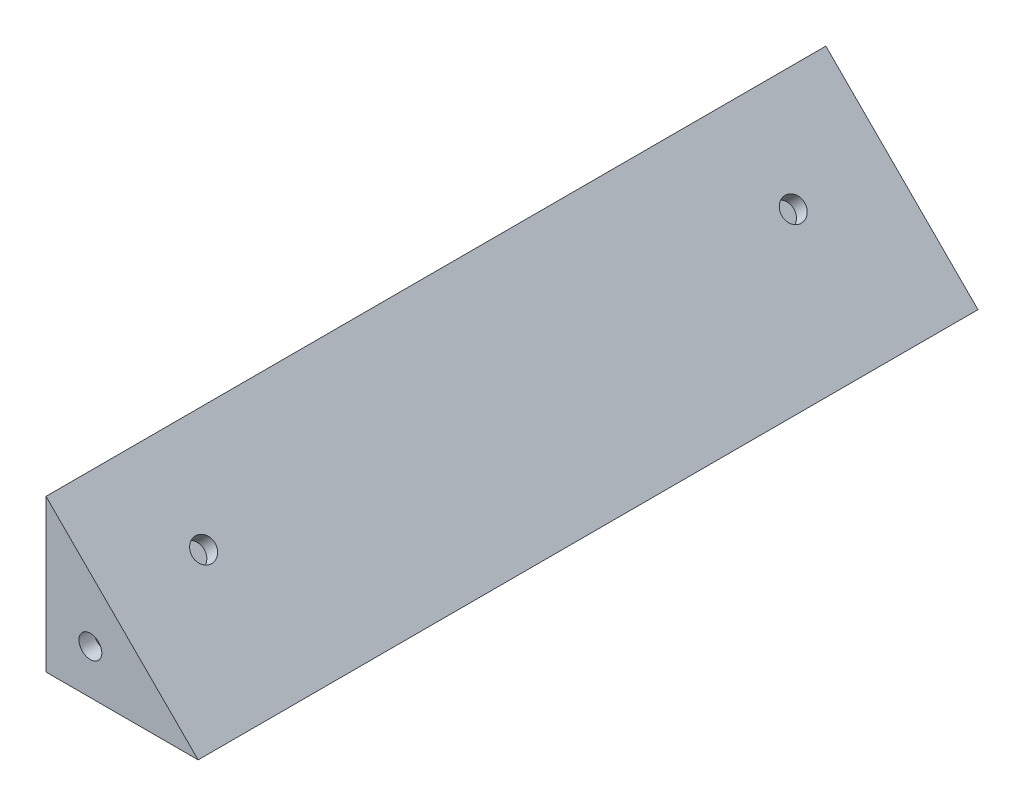
ISO-10303-21;
HEADER;
FILE_DESCRIPTION(('STEP AP214'),'2;1');
FILE_NAME('part.step','',(''),(''),'','','');
FILE_SCHEMA(('AUTOMOTIVE_DESIGN { 1 0 10303 214 1 1 1 1 }'));
ENDSEC;
DATA;
#1=APPLICATION_CONTEXT('core data for automotive mechanical design processes');
#2=APPLICATION_PROTOCOL_DEFINITION('international standard','automotive_design',2000,#1);
#3=PRODUCT_CONTEXT('',#1,'mechanical');
#4=PRODUCT('Part','Part','',(#3));
#5=PRODUCT_RELATED_PRODUCT_CATEGORY('part','',(#4));
#6=PRODUCT_DEFINITION_FORMATION('','',#4);
#7=PRODUCT_DEFINITION_CONTEXT('part definition',#1,'design');
#8=PRODUCT_DEFINITION('design','',#6,#7);
#9=PRODUCT_DEFINITION_SHAPE('','',#8);
#10=(LENGTH_UNIT() NAMED_UNIT(*) SI_UNIT(.MILLI.,.METRE.));
#11=(NAMED_UNIT(*) PLANE_ANGLE_UNIT() SI_UNIT($,.RADIAN.));
#12=(NAMED_UNIT(*) SI_UNIT($,.STERADIAN.) SOLID_ANGLE_UNIT());
#13=UNCERTAINTY_MEASURE_WITH_UNIT(LENGTH_MEASURE(1.E-05),#10,'distance_accuracy_value','');
#14=(GEOMETRIC_REPRESENTATION_CONTEXT(3) GLOBAL_UNCERTAINTY_ASSIGNED_CONTEXT((#13)) GLOBAL_UNIT_ASSIGNED_CONTEXT((#10,
#11,#12)) REPRESENTATION_CONTEXT('',''));
#15=CARTESIAN_POINT('',(0.,0.,0.));
#16=DIRECTION('',(0.,0.,1.));
#17=DIRECTION('',(1.,0.,0.));
#18=AXIS2_PLACEMENT_3D('',#15,#16,#17);
#19=CARTESIAN_POINT('',(3.73725830020305,3.73725830020305,5.));
#20=DIRECTION('',(0.,0.,-1.));
#21=DIRECTION('',(0.,1.,0.));
#22=AXIS2_PLACEMENT_3D('',#19,#20,#21);
#23=PLANE('',#22);
#24=DIRECTION('',(-0.707106781186547,0.707106781186548,0.));
#25=VECTOR('',#24,1.);
#26=CARTESIAN_POINT('',(5.15147186257615,5.15147186257615,5.));
#27=LINE('',#26,#25);
#28=CARTESIAN_POINT('',(10.3029437251523,0.,5.));
#29=VERTEX_POINT('',#28);
#30=CARTESIAN_POINT('',(3.05978332455101,7.24316040060128,5.));
#31=VERTEX_POINT('',#30);
#32=EDGE_CURVE('E243',#29,#31,#27,.T.);
#33=ORIENTED_EDGE('',*,*,#32,.T.);
#34=DIRECTION('',(0.707106781186548,0.707106781186548,0.));
#35=VECTOR('',#34,1.);
#36=CARTESIAN_POINT('',(1.64556976217791,5.82894683822819,5.));
#37=LINE('',#36,#35);
#38=CARTESIAN_POINT('',(1.64556976217791,5.82894683822819,5.));
#39=VERTEX_POINT('',#38);
#40=EDGE_CURVE('E312',#39,#31,#37,.T.);
#41=ORIENTED_EDGE('',*,*,#40,.F.);
#42=DIRECTION('',(-0.707106781186547,0.707106781186548,0.));
#43=VECTOR('',#42,1.);
#44=CARTESIAN_POINT('',(3.73725830020305,3.73725830020305,5.));
#45=LINE('',#44,#43);
#46=CARTESIAN_POINT('',(7.4745166004061,0.,5.));
#47=VERTEX_POINT('',#46);
#48=EDGE_CURVE('E245',#47,#39,#45,.T.);
#49=ORIENTED_EDGE('',*,*,#48,.F.);
#50=DIRECTION('',(-1.,0.,0.));
#51=VECTOR('',#50,1.);
#52=CARTESIAN_POINT('',(0.,0.,5.));
#53=LINE('',#52,#51);
#54=EDGE_CURVE('E237',#29,#47,#53,.T.);
#55=ORIENTED_EDGE('',*,*,#54,.F.);
#56=EDGE_LOOP('',(#33,#41,#49,#55));
#57=FACE_BOUND('',#56,.T.);
#58=ADVANCED_FACE('F79',(#57),#23,.F.);
#59=CARTESIAN_POINT('',(3.73725830020305,3.73725830020305,10.));
#60=DIRECTION('',(0.,0.,1.));
#61=DIRECTION('',(1.,0.,0.));
#62=AXIS2_PLACEMENT_3D('',#59,#60,#61);
#63=PLANE('',#62);
#64=DIRECTION('',(0.707106781186547,-0.707106781186548,0.));
#65=VECTOR('',#64,1.);
#66=CARTESIAN_POINT('',(5.15147186257615,5.15147186257615,10.));
#67=LINE('',#66,#65);
#68=CARTESIAN_POINT('',(3.05978332455101,7.24316040060128,10.));
#69=VERTEX_POINT('',#68);
#70=CARTESIAN_POINT('',(10.3029437251523,0.,10.));
#71=VERTEX_POINT('',#70);
#72=EDGE_CURVE('E261',#69,#71,#67,.T.);
#73=ORIENTED_EDGE('',*,*,#72,.T.);
#74=DIRECTION('',(1.,0.,0.));
#75=VECTOR('',#74,1.);
#76=CARTESIAN_POINT('',(0.,0.,10.));
#77=LINE('',#76,#75);
#78=CARTESIAN_POINT('',(7.4745166004061,0.,10.));
#79=VERTEX_POINT('',#78);
#80=EDGE_CURVE('E239',#79,#71,#77,.T.);
#81=ORIENTED_EDGE('',*,*,#80,.F.);
#82=DIRECTION('',(0.707106781186547,-0.707106781186548,0.));
#83=VECTOR('',#82,1.);
#84=CARTESIAN_POINT('',(3.73725830020305,3.73725830020305,10.));
#85=LINE('',#84,#83);
#86=CARTESIAN_POINT('',(1.64556976217791,5.82894683822819,10.));
#87=VERTEX_POINT('',#86);
#88=EDGE_CURVE('E309',#87,#79,#85,.T.);
#89=ORIENTED_EDGE('',*,*,#88,.F.);
#90=DIRECTION('',(0.707106781186548,0.707106781186548,0.));
#91=VECTOR('',#90,1.);
#92=CARTESIAN_POINT('',(1.64556976217791,5.82894683822819,10.));
#93=LINE('',#92,#91);
#94=EDGE_CURVE('E285',#87,#69,#93,.T.);
#95=ORIENTED_EDGE('',*,*,#94,.T.);
#96=EDGE_LOOP('',(#73,#81,#89,#95));
#97=FACE_BOUND('',#96,.T.);
#98=ADVANCED_FACE('F475',(#97),#63,.F.);
#99=CARTESIAN_POINT('',(-0.893370281794774,8.36788688220088,3.78089240474743));
#100=DIRECTION('',(-0.612372435695794,0.612372435695795,0.5));
#101=DIRECTION('',(-0.707106781186548,-0.707106781186548,0.));
#102=AXIS2_PLACEMENT_3D('',#99,#100,#101);
#103=PLANE('',#102);
#104=DIRECTION('',(0.353553390593274,-0.353553390593274,0.866025403784439));
#105=VECTOR('',#104,1.);
#106=CARTESIAN_POINT('',(0.520843280578321,9.78210044457397,3.78089240474743));
#107=LINE('',#106,#105);
#108=CARTESIAN_POINT('',(2.03916259839135,8.26378112676094,7.5));
#109=VERTEX_POINT('',#108);
#110=EDGE_CURVE('E100',#109,#69,#107,.T.);
#111=ORIENTED_EDGE('',*,*,#110,.T.);
#112=ORIENTED_EDGE('',*,*,#94,.F.);
#113=DIRECTION('',(0.353553390593274,-0.353553390593274,0.866025403784439));
#114=VECTOR('',#113,1.);
#115=CARTESIAN_POINT('',(-0.893370281794774,8.36788688220088,3.78089240474743));
#116=LINE('',#115,#114);
#117=CARTESIAN_POINT('',(0.624949036018256,6.84956756438784,7.5));
#118=VERTEX_POINT('',#117);
#119=EDGE_CURVE('E306',#118,#87,#116,.T.);
#120=ORIENTED_EDGE('',*,*,#119,.F.);
#121=DIRECTION('',(0.707106781186548,0.707106781186548,0.));
#122=VECTOR('',#121,1.);
#123=CARTESIAN_POINT('',(0.624949036018256,6.84956756438784,7.5));
#124=LINE('',#123,#122);
#125=EDGE_CURVE('E314',#118,#109,#124,.T.);
#126=ORIENTED_EDGE('',*,*,#125,.T.);
#127=EDGE_LOOP('',(#111,#112,#120,#126));
#128=FACE_BOUND('',#127,.T.);
#129=ADVANCED_FACE('F480',(#128),#103,.F.);
#130=CARTESIAN_POINT('',(3.69942298592369,3.77509361448241,-0.0308924047474255));
#131=DIRECTION('',(-0.612372435695794,0.612372435695794,-0.500000000000001));
#132=DIRECTION('',(-0.707106781186548,-0.707106781186548,0.));
#133=AXIS2_PLACEMENT_3D('',#130,#131,#132);
#134=PLANE('',#133);
#135=DIRECTION('',(-0.353553390593274,0.353553390593274,0.866025403784438));
#136=VECTOR('',#135,1.);
#137=CARTESIAN_POINT('',(5.11363654829678,5.18930717685551,-0.0308924047474255));
#138=LINE('',#137,#136);
#139=EDGE_CURVE('E251',#31,#109,#138,.T.);
#140=ORIENTED_EDGE('',*,*,#139,.T.);
#141=ORIENTED_EDGE('',*,*,#125,.F.);
#142=DIRECTION('',(-0.353553390593274,0.353553390593274,0.866025403784438));
#143=VECTOR('',#142,1.);
#144=CARTESIAN_POINT('',(3.69942298592369,3.77509361448241,-0.0308924047474255));
#145=LINE('',#144,#143);
#146=EDGE_CURVE('E303',#39,#118,#145,.T.);
#147=ORIENTED_EDGE('',*,*,#146,.F.);
#148=ORIENTED_EDGE('',*,*,#40,.T.);
#149=EDGE_LOOP('',(#140,#141,#147,#148));
#150=FACE_BOUND('',#149,.T.);
#151=ADVANCED_FACE('F485',(#150),#134,.F.);
#152=CARTESIAN_POINT('',(3.73725830020315,3.73725830020295,56.5));
#153=DIRECTION('',(0.,0.,1.));
#154=DIRECTION('',(0.,-1.,0.));
#155=AXIS2_PLACEMENT_3D('',#152,#153,#154);
#156=PLANE('',#155);
#157=DIRECTION('',(0.707106781186547,-0.707106781186548,0.));
#158=VECTOR('',#157,1.);
#159=CARTESIAN_POINT('',(5.15147186257624,5.15147186257605,56.5));
#160=LINE('',#159,#158);
#161=CARTESIAN_POINT('',(3.05978332455101,7.24316040060129,56.5));
#162=VERTEX_POINT('',#161);
#163=CARTESIAN_POINT('',(10.3029437251523,0.,56.5));
#164=VERTEX_POINT('',#163);
#165=EDGE_CURVE('E270',#162,#164,#160,.T.);
#166=ORIENTED_EDGE('',*,*,#165,.T.);
#167=DIRECTION('',(1.,0.,0.));
#168=VECTOR('',#167,1.);
#169=CARTESIAN_POINT('',(0.,0.,56.5));
#170=LINE('',#169,#168);
#171=CARTESIAN_POINT('',(7.4745166004061,0.,56.5));
#172=VERTEX_POINT('',#171);
#173=EDGE_CURVE('E319',#172,#164,#170,.T.);
#174=ORIENTED_EDGE('',*,*,#173,.F.);
#175=DIRECTION('',(0.707106781186547,-0.707106781186548,0.));
#176=VECTOR('',#175,1.);
#177=CARTESIAN_POINT('',(3.73725830020315,3.73725830020295,56.5));
#178=LINE('',#177,#176);
#179=CARTESIAN_POINT('',(1.64556976217791,5.82894683822819,56.5));
#180=VERTEX_POINT('',#179);
#181=EDGE_CURVE('E281',#180,#172,#178,.T.);
#182=ORIENTED_EDGE('',*,*,#181,.F.);
#183=DIRECTION('',(0.707106781186548,0.707106781186548,0.));
#184=VECTOR('',#183,1.);
#185=CARTESIAN_POINT('',(1.64556976217791,5.82894683822819,56.5));
#186=LINE('',#185,#184);
#187=EDGE_CURVE('E294',#180,#162,#186,.T.);
#188=ORIENTED_EDGE('',*,*,#187,.T.);
#189=EDGE_LOOP('',(#166,#174,#182,#188));
#190=FACE_BOUND('',#189,.T.);
#191=ADVANCED_FACE('F458',(#190),#156,.F.);
#192=CARTESIAN_POINT('',(3.73725830020314,3.73725830020296,51.5));
#193=DIRECTION('',(0.,0.,-1.));
#194=DIRECTION('',(0.,1.,0.));
#195=AXIS2_PLACEMENT_3D('',#192,#193,#194);
#196=PLANE('',#195);
#197=DIRECTION('',(-0.707106781186547,0.707106781186548,0.));
#198=VECTOR('',#197,1.);
#199=CARTESIAN_POINT('',(5.15147186257623,5.15147186257606,51.5));
#200=LINE('',#199,#198);
#201=CARTESIAN_POINT('',(10.3029437251523,0.,51.5));
#202=VERTEX_POINT('',#201);
#203=CARTESIAN_POINT('',(3.05978332455101,7.24316040060128,51.5));
#204=VERTEX_POINT('',#203);
#205=EDGE_CURVE('E273',#202,#204,#200,.T.);
#206=ORIENTED_EDGE('',*,*,#205,.T.);
#207=DIRECTION('',(0.707106781186548,0.707106781186548,0.));
#208=VECTOR('',#207,1.);
#209=CARTESIAN_POINT('',(1.64556976217792,5.82894683822818,51.5));
#210=LINE('',#209,#208);
#211=CARTESIAN_POINT('',(1.64556976217792,5.82894683822818,51.5));
#212=VERTEX_POINT('',#211);
#213=EDGE_CURVE('E293',#212,#204,#210,.T.);
#214=ORIENTED_EDGE('',*,*,#213,.F.);
#215=DIRECTION('',(-0.707106781186547,0.707106781186548,0.));
#216=VECTOR('',#215,1.);
#217=CARTESIAN_POINT('',(3.73725830020314,3.73725830020296,51.5));
#218=LINE('',#217,#216);
#219=CARTESIAN_POINT('',(7.4745166004061,0.,51.5));
#220=VERTEX_POINT('',#219);
#221=EDGE_CURVE('E284',#220,#212,#218,.T.);
#222=ORIENTED_EDGE('',*,*,#221,.F.);
#223=DIRECTION('',(-1.,0.,0.));
#224=VECTOR('',#223,1.);
#225=CARTESIAN_POINT('',(0.,0.,51.5));
#226=LINE('',#225,#224);
#227=EDGE_CURVE('E246',#202,#220,#226,.T.);
#228=ORIENTED_EDGE('',*,*,#227,.F.);
#229=EDGE_LOOP('',(#206,#214,#222,#228));
#230=FACE_BOUND('',#229,.T.);
#231=ADVANCED_FACE('F446',(#230),#196,.F.);
#232=CARTESIAN_POINT('',(-15.131029411722,22.6055460121282,15.4058924047476));
#233=DIRECTION('',(-0.612372435695794,0.612372435695794,0.500000000000002));
#234=DIRECTION('',(-0.707106781186548,-0.707106781186547,0.));
#235=AXIS2_PLACEMENT_3D('',#232,#233,#234);
#236=PLANE('',#235);
#237=DIRECTION('',(0.353553390593275,-0.353553390593276,0.866025403784437));
#238=VECTOR('',#237,1.);
#239=CARTESIAN_POINT('',(-13.7168158493489,24.0197595745012,15.4058924047476));
#240=LINE('',#239,#238);
#241=CARTESIAN_POINT('',(2.03916259839135,8.26378112676094,54.));
#242=VERTEX_POINT('',#241);
#243=EDGE_CURVE('E277',#242,#162,#240,.T.);
#244=ORIENTED_EDGE('',*,*,#243,.T.);
#245=ORIENTED_EDGE('',*,*,#187,.F.);
#246=DIRECTION('',(0.353553390593275,-0.353553390593276,0.866025403784437));
#247=VECTOR('',#246,1.);
#248=CARTESIAN_POINT('',(-15.131029411722,22.6055460121282,15.4058924047476));
#249=LINE('',#248,#247);
#250=CARTESIAN_POINT('',(0.624949036018251,6.84956756438785,54.));
#251=VERTEX_POINT('',#250);
#252=EDGE_CURVE('E290',#251,#180,#249,.T.);
#253=ORIENTED_EDGE('',*,*,#252,.F.);
#254=DIRECTION('',(0.707106781186548,0.707106781186548,0.));
#255=VECTOR('',#254,1.);
#256=CARTESIAN_POINT('',(0.624949036018251,6.84956756438785,54.));
#257=LINE('',#256,#255);
#258=EDGE_CURVE('E297',#251,#242,#257,.T.);
#259=ORIENTED_EDGE('',*,*,#258,.T.);
#260=EDGE_LOOP('',(#244,#245,#253,#259));
#261=FACE_BOUND('',#260,.T.);
#262=ADVANCED_FACE('F454',(#261),#236,.F.);
#263=CARTESIAN_POINT('',(17.9370821158509,-10.4625655154448,11.5941075952525));
#264=DIRECTION('',(-0.612372435695795,0.612372435695795,-0.499999999999998));
#265=DIRECTION('',(-0.707106781186548,-0.707106781186547,0.));
#266=AXIS2_PLACEMENT_3D('',#263,#264,#265);
#267=PLANE('',#266);
#268=DIRECTION('',(-0.353553390593272,0.353553390593273,0.86602540378444));
#269=VECTOR('',#268,1.);
#270=CARTESIAN_POINT('',(19.351295678224,-9.04835195307167,11.5941075952525));
#271=LINE('',#270,#269);
#272=EDGE_CURVE('E275',#204,#242,#271,.T.);
#273=ORIENTED_EDGE('',*,*,#272,.T.);
#274=ORIENTED_EDGE('',*,*,#258,.F.);
#275=DIRECTION('',(-0.353553390593272,0.353553390593273,0.86602540378444));
#276=VECTOR('',#275,1.);
#277=CARTESIAN_POINT('',(17.9370821158509,-10.4625655154448,11.5941075952525));
#278=LINE('',#277,#276);
#279=EDGE_CURVE('E287',#212,#251,#278,.T.);
#280=ORIENTED_EDGE('',*,*,#279,.F.);
#281=ORIENTED_EDGE('',*,*,#213,.T.);
#282=EDGE_LOOP('',(#273,#274,#280,#281));
#283=FACE_BOUND('',#282,.T.);
#284=ADVANCED_FACE('F451',(#283),#267,.F.);
#285=CARTESIAN_POINT('',(1.73223304703364,1.73223304703364,58.3));
#286=DIRECTION('',(-0.707106781186548,-0.707106781186548,0.));
#287=DIRECTION('',(0.707106781186548,-0.707106781186548,0.));
#288=AXIS2_PLACEMENT_3D('',#285,#286,#287);
#289=PLANE('',#288);
#290=DIRECTION('',(0.707106781186547,-0.707106781186548,0.));
#291=VECTOR('',#290,1.);
#292=CARTESIAN_POINT('',(1.73223304703364,1.73223304703364,60.3));
#293=LINE('',#292,#291);
#294=CARTESIAN_POINT('',(0.711612320873983,2.75285377319329,60.3));
#295=VERTEX_POINT('',#294);
#296=CARTESIAN_POINT('',(3.46446609406726,0.,60.3));
#297=VERTEX_POINT('',#296);
#298=EDGE_CURVE('E326',#295,#297,#293,.T.);
#299=ORIENTED_EDGE('',*,*,#298,.T.);
#300=DIRECTION('',(0.,0.,1.));
#301=VECTOR('',#300,1.);
#302=CARTESIAN_POINT('',(3.46446609406726,0.,58.3));
#303=LINE('',#302,#301);
#304=CARTESIAN_POINT('',(3.46446609406726,0.,58.3));
#305=VERTEX_POINT('',#304);
#306=EDGE_CURVE('E354',#305,#297,#303,.T.);
#307=ORIENTED_EDGE('',*,*,#306,.F.);
#308=DIRECTION('',(0.707106781186547,-0.707106781186548,0.));
#309=VECTOR('',#308,1.);
#310=CARTESIAN_POINT('',(1.73223304703364,1.73223304703364,58.3));
#311=LINE('',#310,#309);
#312=CARTESIAN_POINT('',(0.711612320873983,2.75285377319329,58.3));
#313=VERTEX_POINT('',#312);
#314=EDGE_CURVE('E337',#313,#305,#311,.T.);
#315=ORIENTED_EDGE('',*,*,#314,.F.);
#316=DIRECTION('',(0.,0.,1.));
#317=VECTOR('',#316,1.);
#318=CARTESIAN_POINT('',(0.711612320873983,2.75285377319329,58.3));
#319=LINE('',#318,#317);
#320=EDGE_CURVE('E355',#313,#295,#319,.T.);
#321=ORIENTED_EDGE('',*,*,#320,.T.);
#322=EDGE_LOOP('',(#299,#307,#315,#321));
#323=FACE_BOUND('',#322,.T.);
#324=ADVANCED_FACE('F505',(#323),#289,.F.);
#325=CARTESIAN_POINT('',(-0.0242701090998959,0.00650315613353235,58.3));
#326=DIRECTION('',(-0.965925826289068,0.258819045102521,0.));
#327=DIRECTION('',(-0.258819045102521,-0.965925826289068,0.));
#328=AXIS2_PLACEMENT_3D('',#325,#326,#327);
#329=PLANE('',#328);
#330=DIRECTION('',(-0.258819045102521,-0.965925826289068,0.));
#331=VECTOR('',#330,1.);
#332=CARTESIAN_POINT('',(-0.0242701090998959,0.00650315613353235,60.3));
#333=LINE('',#332,#331);
#334=CARTESIAN_POINT('',(1.45875854768069,5.54124145231931,60.3));
#335=VERTEX_POINT('',#334);
#336=EDGE_CURVE('E335',#335,#295,#333,.T.);
#337=ORIENTED_EDGE('',*,*,#336,.T.);
#338=ORIENTED_EDGE('',*,*,#320,.F.);
#339=DIRECTION('',(-0.258819045102521,-0.965925826289068,0.));
#340=VECTOR('',#339,1.);
#341=CARTESIAN_POINT('',(-0.0242701090998959,0.00650315613353235,58.3));
#342=LINE('',#341,#340);
#343=CARTESIAN_POINT('',(1.45875854768069,5.54124145231931,58.3));
#344=VERTEX_POINT('',#343);
#345=EDGE_CURVE('E351',#344,#313,#342,.T.);
#346=ORIENTED_EDGE('',*,*,#345,.F.);
#347=DIRECTION('',(0.,0.,1.));
#348=VECTOR('',#347,1.);
#349=CARTESIAN_POINT('',(1.45875854768069,5.54124145231931,58.3));
#350=LINE('',#349,#348);
#351=EDGE_CURVE('E359',#344,#335,#350,.T.);
#352=ORIENTED_EDGE('',*,*,#351,.T.);
#353=EDGE_LOOP('',(#337,#338,#346,#352));
#354=FACE_BOUND('',#353,.T.);
#355=ADVANCED_FACE('F501',(#354),#329,.F.);
#356=CARTESIAN_POINT('',(-1.28759206937907,4.80535902234543,58.3));
#357=DIRECTION('',(-0.258819045102521,0.965925826289068,0.));
#358=DIRECTION('',(-0.965925826289068,-0.258819045102521,0.));
#359=AXIS2_PLACEMENT_3D('',#356,#357,#358);
#360=PLANE('',#359);
#361=DIRECTION('',(-0.965925826289068,-0.258819045102521,0.));
#362=VECTOR('',#361,1.);
#363=CARTESIAN_POINT('',(-1.28759206937907,4.80535902234543,60.3));
#364=LINE('',#363,#362);
#365=CARTESIAN_POINT('',(4.24714622680671,6.28838767912602,60.3));
#366=VERTEX_POINT('',#365);
#367=EDGE_CURVE('E333',#366,#335,#364,.T.);
#368=ORIENTED_EDGE('',*,*,#367,.T.);
#369=ORIENTED_EDGE('',*,*,#351,.F.);
#370=DIRECTION('',(-0.965925826289068,-0.258819045102521,0.));
#371=VECTOR('',#370,1.);
#372=CARTESIAN_POINT('',(-1.28759206937907,4.80535902234543,58.3));
#373=LINE('',#372,#371);
#374=CARTESIAN_POINT('',(4.24714622680671,6.28838767912602,58.3));
#375=VERTEX_POINT('',#374);
#376=EDGE_CURVE('E348',#375,#344,#373,.T.);
#377=ORIENTED_EDGE('',*,*,#376,.F.);
#378=DIRECTION('',(0.,0.,1.));
#379=VECTOR('',#378,1.);
#380=CARTESIAN_POINT('',(4.24714622680671,6.28838767912602,58.3));
#381=LINE('',#380,#379);
#382=EDGE_CURVE('E362',#375,#366,#381,.T.);
#383=ORIENTED_EDGE('',*,*,#382,.T.);
#384=EDGE_LOOP('',(#368,#369,#377,#383));
#385=FACE_BOUND('',#384,.T.);
#386=ADVANCED_FACE('F504',(#385),#360,.F.);
#387=CARTESIAN_POINT('',(5.26776695296636,5.26776695296636,58.3));
#388=DIRECTION('',(0.707106781186547,0.707106781186548,0.));
#389=DIRECTION('',(-0.707106781186548,0.707106781186547,0.));
#390=AXIS2_PLACEMENT_3D('',#387,#388,#389);
#391=PLANE('',#390);
#392=DIRECTION('',(-0.707106781186548,0.707106781186547,0.));
#393=VECTOR('',#392,1.);
#394=CARTESIAN_POINT('',(5.26776695296636,5.26776695296636,60.3));
#395=LINE('',#394,#393);
#396=CARTESIAN_POINT('',(10.5355339059327,0.,60.3));
#397=VERTEX_POINT('',#396);
#398=EDGE_CURVE('E331',#397,#366,#395,.T.);
#399=ORIENTED_EDGE('',*,*,#398,.T.);
#400=ORIENTED_EDGE('',*,*,#382,.F.);
#401=DIRECTION('',(-0.707106781186548,0.707106781186547,0.));
#402=VECTOR('',#401,1.);
#403=CARTESIAN_POINT('',(5.26776695296636,5.26776695296636,58.3));
#404=LINE('',#403,#402);
#405=CARTESIAN_POINT('',(10.5355339059327,0.,58.3));
#406=VERTEX_POINT('',#405);
#407=EDGE_CURVE('E345',#406,#375,#404,.T.);
#408=ORIENTED_EDGE('',*,*,#407,.F.);
#409=DIRECTION('',(0.,0.,1.));
#410=VECTOR('',#409,1.);
#411=CARTESIAN_POINT('',(10.5355339059327,0.,58.3));
#412=LINE('',#411,#410);
#413=EDGE_CURVE('E365',#406,#397,#412,.T.);
#414=ORIENTED_EDGE('',*,*,#413,.T.);
#415=EDGE_LOOP('',(#399,#400,#408,#414));
#416=FACE_BOUND('',#415,.T.);
#417=ADVANCED_FACE('F509',(#416),#391,.F.);
#418=CARTESIAN_POINT('',(0.,0.,61.5));
#419=DIRECTION('',(0.,1.,0.));
#420=DIRECTION('',(0.,0.,1.));
#421=AXIS2_PLACEMENT_3D('',#418,#419,#420);
#422=PLANE('',#421);
#423=DIRECTION('',(1.,0.,0.));
#424=VECTOR('',#423,1.);
#425=CARTESIAN_POINT('',(0.,0.,0.));
#426=LINE('',#425,#424);
#427=CARTESIAN_POINT('',(0.,0.,0.));
#428=VERTEX_POINT('',#427);
#429=CARTESIAN_POINT('',(12.,0.,0.));
#430=VERTEX_POINT('',#429);
#431=EDGE_CURVE('E425',#428,#430,#426,.T.);
#432=ORIENTED_EDGE('',*,*,#431,.T.);
#433=DIRECTION('',(0.,0.,-1.));
#434=VECTOR('',#433,1.);
#435=CARTESIAN_POINT('',(12.,0.,61.5));
#436=LINE('',#435,#434);
#437=CARTESIAN_POINT('',(12.,0.,61.5));
#438=VERTEX_POINT('',#437);
#439=EDGE_CURVE('E431',#438,#430,#436,.T.);
#440=ORIENTED_EDGE('',*,*,#439,.F.);
#441=DIRECTION('',(1.,0.,0.));
#442=VECTOR('',#441,1.);
#443=CARTESIAN_POINT('',(0.,0.,61.5));
#444=LINE('',#443,#442);
#445=CARTESIAN_POINT('',(0.,0.,61.5));
#446=VERTEX_POINT('',#445);
#447=EDGE_CURVE('E416',#446,#438,#444,.T.);
#448=ORIENTED_EDGE('',*,*,#447,.F.);
#449=DIRECTION('',(0.,0.,-1.));
#450=VECTOR('',#449,1.);
#451=CARTESIAN_POINT('',(0.,0.,61.5));
#452=LINE('',#451,#450);
#453=EDGE_CURVE('E433',#446,#428,#452,.T.);
#454=ORIENTED_EDGE('',*,*,#453,.T.);
#455=EDGE_LOOP('',(#432,#440,#448,#454));
#456=FACE_BOUND('',#455,.T.);
#457=ORIENTED_EDGE('',*,*,#173,.T.);
#458=DIRECTION('',(0.,0.,1.));
#459=VECTOR('',#458,1.);
#460=CARTESIAN_POINT('',(10.3029437251523,0.,0.));
#461=LINE('',#460,#459);
#462=EDGE_CURVE('E256',#202,#164,#461,.T.);
#463=ORIENTED_EDGE('',*,*,#462,.F.);
#464=ORIENTED_EDGE('',*,*,#227,.T.);
#465=DIRECTION('',(0.,0.,-1.));
#466=VECTOR('',#465,1.);
#467=CARTESIAN_POINT('',(7.4745166004061,0.,61.5));
#468=LINE('',#467,#466);
#469=EDGE_CURVE('E87',#172,#220,#468,.T.);
#470=ORIENTED_EDGE('',*,*,#469,.F.);
#471=EDGE_LOOP('',(#457,#463,#464,#470));
#472=FACE_BOUND('',#471,.T.);
#473=ORIENTED_EDGE('',*,*,#80,.T.);
#474=DIRECTION('',(0.,0.,1.));
#475=VECTOR('',#474,1.);
#476=CARTESIAN_POINT('',(10.3029437251523,0.,0.));
#477=LINE('',#476,#475);
#478=EDGE_CURVE('E12',#29,#71,#477,.T.);
#479=ORIENTED_EDGE('',*,*,#478,.F.);
#480=ORIENTED_EDGE('',*,*,#54,.T.);
#481=DIRECTION('',(0.,0.,-1.));
#482=VECTOR('',#481,1.);
#483=CARTESIAN_POINT('',(7.4745166004061,0.,61.5));
#484=LINE('',#483,#482);
#485=EDGE_CURVE('E435',#79,#47,#484,.T.);
#486=ORIENTED_EDGE('',*,*,#485,.F.);
#487=EDGE_LOOP('',(#473,#479,#480,#486));
#488=FACE_BOUND('',#487,.T.);
#489=DIRECTION('',(1.,0.,0.));
#490=VECTOR('',#489,1.);
#491=CARTESIAN_POINT('',(0.,0.,58.3));
#492=LINE('',#491,#490);
#493=EDGE_CURVE('E342',#305,#406,#492,.T.);
#494=ORIENTED_EDGE('',*,*,#493,.F.);
#495=ORIENTED_EDGE('',*,*,#306,.T.);
#496=DIRECTION('',(1.,0.,0.));
#497=VECTOR('',#496,1.);
#498=CARTESIAN_POINT('',(0.,0.,60.3));
#499=LINE('',#498,#497);
#500=EDGE_CURVE('E328',#297,#397,#499,.T.);
#501=ORIENTED_EDGE('',*,*,#500,.T.);
#502=ORIENTED_EDGE('',*,*,#413,.F.);
#503=EDGE_LOOP('',(#494,#495,#501,#502));
#504=FACE_BOUND('',#503,.T.);
#505=DIRECTION('',(0.,0.,-1.));
#506=VECTOR('',#505,1.);
#507=CARTESIAN_POINT('',(10.5355339059327,0.,3.2));
#508=LINE('',#507,#506);
#509=CARTESIAN_POINT('',(10.5355339059327,0.,3.2));
#510=VERTEX_POINT('',#509);
#511=CARTESIAN_POINT('',(10.5355339059327,0.,1.2));
#512=VERTEX_POINT('',#511);
#513=EDGE_CURVE('E406',#510,#512,#508,.T.);
#514=ORIENTED_EDGE('',*,*,#513,.T.);
#515=DIRECTION('',(1.,0.,0.));
#516=VECTOR('',#515,1.);
#517=CARTESIAN_POINT('',(0.,0.,1.2));
#518=LINE('',#517,#516);
#519=CARTESIAN_POINT('',(3.46446609406726,0.,1.2));
#520=VERTEX_POINT('',#519);
#521=EDGE_CURVE('E375',#520,#512,#518,.T.);
#522=ORIENTED_EDGE('',*,*,#521,.F.);
#523=DIRECTION('',(0.,0.,-1.));
#524=VECTOR('',#523,1.);
#525=CARTESIAN_POINT('',(3.46446609406726,0.,3.2));
#526=LINE('',#525,#524);
#527=CARTESIAN_POINT('',(3.46446609406726,0.,3.2));
#528=VERTEX_POINT('',#527);
#529=EDGE_CURVE('E409',#528,#520,#526,.T.);
#530=ORIENTED_EDGE('',*,*,#529,.F.);
#531=DIRECTION('',(1.,0.,0.));
#532=VECTOR('',#531,1.);
#533=CARTESIAN_POINT('',(0.,0.,3.2));
#534=LINE('',#533,#532);
#535=EDGE_CURVE('E388',#528,#510,#534,.T.);
#536=ORIENTED_EDGE('',*,*,#535,.T.);
#537=EDGE_LOOP('',(#514,#522,#530,#536));
#538=FACE_BOUND('',#537,.T.);
#539=ADVANCED_FACE('F234',(#456,#472,#488,#504,#538),#422,.F.);
#540=CARTESIAN_POINT('',(0.,0.,0.));
#541=DIRECTION('',(0.,0.,1.));
#542=DIRECTION('',(1.,0.,0.));
#543=AXIS2_PLACEMENT_3D('',#540,#541,#542);
#544=PLANE('',#543);
#545=DIRECTION('',(0.707106781186548,-0.707106781186548,0.));
#546=VECTOR('',#545,1.);
#547=CARTESIAN_POINT('',(6.,6.,0.));
#548=LINE('',#547,#546);
#549=CARTESIAN_POINT('',(0.,12.,0.));
#550=VERTEX_POINT('',#549);
#551=EDGE_CURVE('E417',#550,#430,#548,.T.);
#552=ORIENTED_EDGE('',*,*,#551,.T.);
#553=ORIENTED_EDGE('',*,*,#431,.F.);
#554=DIRECTION('',(0.,1.,0.));
#555=VECTOR('',#554,1.);
#556=CARTESIAN_POINT('',(0.,0.,0.));
#557=LINE('',#556,#555);
#558=EDGE_CURVE('E412',#428,#550,#557,.T.);
#559=ORIENTED_EDGE('',*,*,#558,.T.);
#560=EDGE_LOOP('',(#552,#553,#559));
#561=FACE_BOUND('',#560,.T.);
#562=CARTESIAN_POINT('',(3.5,3.5,0.));
#563=DIRECTION('',(0.,0.,1.));
#564=DIRECTION('',(1.,0.,0.));
#565=AXIS2_PLACEMENT_3D('',#562,#563,#564);
#566=CIRCLE('',#565,0.9);
#567=CARTESIAN_POINT('',(4.4,3.5,0.));
#568=VERTEX_POINT('',#567);
#569=EDGE_CURVE('E358',#568,#568,#566,.T.);
#570=ORIENTED_EDGE('',*,*,#569,.T.);
#571=EDGE_LOOP('',(#570));
#572=FACE_BOUND('',#571,.T.);
#573=ADVANCED_FACE('F549',(#561,#572),#544,.F.);
#574=CARTESIAN_POINT('',(0.,0.,61.5));
#575=DIRECTION('',(-1.,0.,0.));
#576=DIRECTION('',(0.,0.,1.));
#577=AXIS2_PLACEMENT_3D('',#574,#575,#576);
#578=PLANE('',#577);
#579=ORIENTED_EDGE('',*,*,#558,.F.);
#580=ORIENTED_EDGE('',*,*,#453,.F.);
#581=DIRECTION('',(0.,1.,0.));
#582=VECTOR('',#581,1.);
#583=CARTESIAN_POINT('',(0.,0.,61.5));
#584=LINE('',#583,#582);
#585=CARTESIAN_POINT('',(0.,12.,61.5));
#586=VERTEX_POINT('',#585);
#587=EDGE_CURVE('E413',#446,#586,#584,.T.);
#588=ORIENTED_EDGE('',*,*,#587,.T.);
#589=DIRECTION('',(0.,0.,-1.));
#590=VECTOR('',#589,1.);
#591=CARTESIAN_POINT('',(0.,12.,61.5));
#592=LINE('',#591,#590);
#593=EDGE_CURVE('E422',#586,#550,#592,.T.);
#594=ORIENTED_EDGE('',*,*,#593,.T.);
#595=EDGE_LOOP('',(#579,#580,#588,#594));
#596=FACE_BOUND('',#595,.T.);
#597=ADVANCED_FACE('F81',(#596),#578,.T.);
#598=CARTESIAN_POINT('',(6.,6.,61.5));
#599=DIRECTION('',(0.707106781186548,0.707106781186548,0.));
#600=DIRECTION('',(-0.707106781186548,0.707106781186548,0.));
#601=AXIS2_PLACEMENT_3D('',#598,#599,#600);
#602=PLANE('',#601);
#603=ORIENTED_EDGE('',*,*,#439,.T.);
#604=ORIENTED_EDGE('',*,*,#551,.F.);
#605=ORIENTED_EDGE('',*,*,#593,.F.);
#606=DIRECTION('',(0.707106781186548,-0.707106781186548,0.));
#607=VECTOR('',#606,1.);
#608=CARTESIAN_POINT('',(6.,6.,61.5));
#609=LINE('',#608,#607);
#610=EDGE_CURVE('E419',#586,#438,#609,.T.);
#611=ORIENTED_EDGE('',*,*,#610,.T.);
#612=EDGE_LOOP('',(#603,#604,#605,#611));
#613=FACE_BOUND('',#612,.T.);
#614=CARTESIAN_POINT('',(4.92893218813453,7.07106781186549,54.));
#615=DIRECTION('',(0.707106781186548,0.707106781186547,0.));
#616=DIRECTION('',(-0.707106781186547,0.707106781186548,0.));
#617=AXIS2_PLACEMENT_3D('',#614,#615,#616);
#618=CIRCLE('',#617,0.899999999999997);
#619=CARTESIAN_POINT('',(4.29253608506664,7.70746391493338,54.));
#620=VERTEX_POINT('',#619);
#621=EDGE_CURVE('E265',#620,#620,#618,.T.);
#622=ORIENTED_EDGE('',*,*,#621,.F.);
#623=EDGE_LOOP('',(#622));
#624=FACE_BOUND('',#623,.T.);
#625=CARTESIAN_POINT('',(4.92893218813453,7.07106781186548,7.5));
#626=DIRECTION('',(0.707106781186548,0.707106781186547,0.));
#627=DIRECTION('',(-0.707106781186547,0.707106781186548,0.));
#628=AXIS2_PLACEMENT_3D('',#625,#626,#627);
#629=CIRCLE('',#628,0.899999999999999);
#630=CARTESIAN_POINT('',(4.29253608506663,7.70746391493337,7.5));
#631=VERTEX_POINT('',#630);
#632=EDGE_CURVE('E252',#631,#631,#629,.T.);
#633=ORIENTED_EDGE('',*,*,#632,.F.);
#634=EDGE_LOOP('',(#633));
#635=FACE_BOUND('',#634,.T.);
#636=ADVANCED_FACE('F547',(#613,#624,#635),#602,.T.);
#637=CARTESIAN_POINT('',(0.,0.,61.5));
#638=DIRECTION('',(0.,0.,1.));
#639=DIRECTION('',(1.,0.,0.));
#640=AXIS2_PLACEMENT_3D('',#637,#638,#639);
#641=PLANE('',#640);
#642=ORIENTED_EDGE('',*,*,#447,.T.);
#643=ORIENTED_EDGE('',*,*,#610,.F.);
#644=ORIENTED_EDGE('',*,*,#587,.F.);
#645=EDGE_LOOP('',(#642,#643,#644));
#646=FACE_BOUND('',#645,.T.);
#647=CARTESIAN_POINT('',(3.5,3.5,61.5));
#648=DIRECTION('',(0.,0.,1.));
#649=DIRECTION('',(1.,0.,0.));
#650=AXIS2_PLACEMENT_3D('',#647,#648,#649);
#651=CIRCLE('',#650,0.9);
#652=CARTESIAN_POINT('',(4.4,3.5,61.5));
#653=VERTEX_POINT('',#652);
#654=EDGE_CURVE('E322',#653,#653,#651,.T.);
#655=ORIENTED_EDGE('',*,*,#654,.F.);
#656=EDGE_LOOP('',(#655));
#657=FACE_BOUND('',#656,.T.);
#658=ADVANCED_FACE('F540',(#646,#657),#641,.T.);
#659=CARTESIAN_POINT('',(5.26776695296637,5.26776695296637,3.2));
#660=DIRECTION('',(-0.707106781186547,-0.707106781186548,0.));
#661=DIRECTION('',(0.707106781186548,-0.707106781186547,0.));
#662=AXIS2_PLACEMENT_3D('',#659,#660,#661);
#663=PLANE('',#662);
#664=DIRECTION('',(-0.707106781186548,0.707106781186547,0.));
#665=VECTOR('',#664,1.);
#666=CARTESIAN_POINT('',(5.26776695296637,5.26776695296637,1.2));
#667=LINE('',#666,#665);
#668=CARTESIAN_POINT('',(4.24714622680671,6.28838767912603,1.2));
#669=VERTEX_POINT('',#668);
#670=EDGE_CURVE('E377',#512,#669,#667,.T.);
#671=ORIENTED_EDGE('',*,*,#670,.F.);
#672=ORIENTED_EDGE('',*,*,#513,.F.);
#673=DIRECTION('',(-0.707106781186548,0.707106781186547,0.));
#674=VECTOR('',#673,1.);
#675=CARTESIAN_POINT('',(5.26776695296637,5.26776695296637,3.2));
#676=LINE('',#675,#674);
#677=CARTESIAN_POINT('',(4.24714622680671,6.28838767912603,3.2));
#678=VERTEX_POINT('',#677);
#679=EDGE_CURVE('E391',#510,#678,#676,.T.);
#680=ORIENTED_EDGE('',*,*,#679,.T.);
#681=DIRECTION('',(0.,0.,-1.));
#682=VECTOR('',#681,1.);
#683=CARTESIAN_POINT('',(4.24714622680671,6.28838767912603,3.2));
#684=LINE('',#683,#682);
#685=EDGE_CURVE('E403',#678,#669,#684,.T.);
#686=ORIENTED_EDGE('',*,*,#685,.T.);
#687=EDGE_LOOP('',(#671,#672,#680,#686));
#688=FACE_BOUND('',#687,.T.);
#689=ADVANCED_FACE('F536',(#688),#663,.T.);
#690=CARTESIAN_POINT('',(-1.28759206937907,4.80535902234544,3.2));
#691=DIRECTION('',(0.258819045102521,-0.965925826289068,0.));
#692=DIRECTION('',(0.965925826289068,0.258819045102521,0.));
#693=AXIS2_PLACEMENT_3D('',#690,#691,#692);
#694=PLANE('',#693);
#695=DIRECTION('',(-0.965925826289068,-0.258819045102521,0.));
#696=VECTOR('',#695,1.);
#697=CARTESIAN_POINT('',(-1.28759206937907,4.80535902234544,1.2));
#698=LINE('',#697,#696);
#699=CARTESIAN_POINT('',(1.45875854768068,5.54124145231932,1.2));
#700=VERTEX_POINT('',#699);
#701=EDGE_CURVE('E379',#669,#700,#698,.T.);
#702=ORIENTED_EDGE('',*,*,#701,.F.);
#703=ORIENTED_EDGE('',*,*,#685,.F.);
#704=DIRECTION('',(-0.965925826289068,-0.258819045102521,0.));
#705=VECTOR('',#704,1.);
#706=CARTESIAN_POINT('',(-1.28759206937907,4.80535902234544,3.2));
#707=LINE('',#706,#705);
#708=CARTESIAN_POINT('',(1.45875854768068,5.54124145231932,3.2));
#709=VERTEX_POINT('',#708);
#710=EDGE_CURVE('E393',#678,#709,#707,.T.);
#711=ORIENTED_EDGE('',*,*,#710,.T.);
#712=DIRECTION('',(0.,0.,-1.));
#713=VECTOR('',#712,1.);
#714=CARTESIAN_POINT('',(1.45875854768068,5.54124145231932,3.2));
#715=LINE('',#714,#713);
#716=EDGE_CURVE('E400',#709,#700,#715,.T.);
#717=ORIENTED_EDGE('',*,*,#716,.T.);
#718=EDGE_LOOP('',(#702,#703,#711,#717));
#719=FACE_BOUND('',#718,.T.);
#720=ADVANCED_FACE('F532',(#719),#694,.T.);
#721=CARTESIAN_POINT('',(-0.0242701090999039,0.00650315613353448,3.2));
#722=DIRECTION('',(0.965925826289068,-0.258819045102521,0.));
#723=DIRECTION('',(0.258819045102521,0.965925826289068,0.));
#724=AXIS2_PLACEMENT_3D('',#721,#722,#723);
#725=PLANE('',#724);
#726=DIRECTION('',(-0.258819045102521,-0.965925826289068,0.));
#727=VECTOR('',#726,1.);
#728=CARTESIAN_POINT('',(-0.0242701090999039,0.00650315613353448,1.2));
#729=LINE('',#728,#727);
#730=CARTESIAN_POINT('',(0.711612320873972,2.75285377319329,1.2));
#731=VERTEX_POINT('',#730);
#732=EDGE_CURVE('E381',#700,#731,#729,.T.);
#733=ORIENTED_EDGE('',*,*,#732,.F.);
#734=ORIENTED_EDGE('',*,*,#716,.F.);
#735=DIRECTION('',(-0.258819045102521,-0.965925826289068,0.));
#736=VECTOR('',#735,1.);
#737=CARTESIAN_POINT('',(-0.0242701090999039,0.00650315613353448,3.2));
#738=LINE('',#737,#736);
#739=CARTESIAN_POINT('',(0.711612320873972,2.75285377319329,3.2));
#740=VERTEX_POINT('',#739);
#741=EDGE_CURVE('E395',#709,#740,#738,.T.);
#742=ORIENTED_EDGE('',*,*,#741,.T.);
#743=DIRECTION('',(0.,0.,-1.));
#744=VECTOR('',#743,1.);
#745=CARTESIAN_POINT('',(0.711612320873972,2.75285377319329,3.2));
#746=LINE('',#745,#744);
#747=EDGE_CURVE('E397',#740,#731,#746,.T.);
#748=ORIENTED_EDGE('',*,*,#747,.T.);
#749=EDGE_LOOP('',(#733,#734,#742,#748));
#750=FACE_BOUND('',#749,.T.);
#751=ADVANCED_FACE('F529',(#750),#725,.T.);
#752=CARTESIAN_POINT('',(1.73223304703363,1.73223304703363,3.2));
#753=DIRECTION('',(0.707106781186548,0.707106781186548,0.));
#754=DIRECTION('',(-0.707106781186548,0.707106781186548,0.));
#755=AXIS2_PLACEMENT_3D('',#752,#753,#754);
#756=PLANE('',#755);
#757=DIRECTION('',(0.707106781186548,-0.707106781186548,0.));
#758=VECTOR('',#757,1.);
#759=CARTESIAN_POINT('',(1.73223304703363,1.73223304703363,1.2));
#760=LINE('',#759,#758);
#761=EDGE_CURVE('E372',#731,#520,#760,.T.);
#762=ORIENTED_EDGE('',*,*,#761,.F.);
#763=ORIENTED_EDGE('',*,*,#747,.F.);
#764=DIRECTION('',(0.707106781186548,-0.707106781186548,0.));
#765=VECTOR('',#764,1.);
#766=CARTESIAN_POINT('',(1.73223304703363,1.73223304703363,3.2));
#767=LINE('',#766,#765);
#768=EDGE_CURVE('E383',#740,#528,#767,.T.);
#769=ORIENTED_EDGE('',*,*,#768,.T.);
#770=ORIENTED_EDGE('',*,*,#529,.T.);
#771=EDGE_LOOP('',(#762,#763,#769,#770));
#772=FACE_BOUND('',#771,.T.);
#773=ADVANCED_FACE('F527',(#772),#756,.T.);
#774=CARTESIAN_POINT('',(0.,0.,3.2));
#775=DIRECTION('',(0.,0.,1.));
#776=DIRECTION('',(1.,0.,0.));
#777=AXIS2_PLACEMENT_3D('',#774,#775,#776);
#778=PLANE('',#777);
#779=ORIENTED_EDGE('',*,*,#768,.F.);
#780=ORIENTED_EDGE('',*,*,#741,.F.);
#781=ORIENTED_EDGE('',*,*,#710,.F.);
#782=ORIENTED_EDGE('',*,*,#679,.F.);
#783=ORIENTED_EDGE('',*,*,#535,.F.);
#784=EDGE_LOOP('',(#779,#780,#781,#782,#783));
#785=FACE_BOUND('',#784,.T.);
#786=ADVANCED_FACE('F523',(#785),#778,.F.);
#787=CARTESIAN_POINT('',(3.5,3.5,1.2));
#788=DIRECTION('',(0.,0.,-1.));
#789=DIRECTION('',(-1.,0.,0.));
#790=AXIS2_PLACEMENT_3D('',#787,#788,#789);
#791=CYLINDRICAL_SURFACE('',#790,0.9);
#792=CARTESIAN_POINT('',(3.5,3.5,1.2));
#793=DIRECTION('',(0.,0.,1.));
#794=DIRECTION('',(1.,0.,0.));
#795=AXIS2_PLACEMENT_3D('',#792,#793,#794);
#796=CIRCLE('',#795,0.9);
#797=CARTESIAN_POINT('',(4.4,3.5,1.2));
#798=VERTEX_POINT('',#797);
#799=EDGE_CURVE('E369',#798,#798,#796,.T.);
#800=ORIENTED_EDGE('',*,*,#799,.T.);
#801=EDGE_LOOP('',(#800));
#802=FACE_BOUND('',#801,.T.);
#803=ORIENTED_EDGE('',*,*,#569,.F.);
#804=EDGE_LOOP('',(#803));
#805=FACE_BOUND('',#804,.T.);
#806=ADVANCED_FACE('F519',(#802,#805),#791,.F.);
#807=CARTESIAN_POINT('',(0.,0.,1.2));
#808=DIRECTION('',(0.,0.,1.));
#809=DIRECTION('',(1.,0.,0.));
#810=AXIS2_PLACEMENT_3D('',#807,#808,#809);
#811=PLANE('',#810);
#812=ORIENTED_EDGE('',*,*,#799,.F.);
#813=EDGE_LOOP('',(#812));
#814=FACE_BOUND('',#813,.T.);
#815=ORIENTED_EDGE('',*,*,#761,.T.);
#816=ORIENTED_EDGE('',*,*,#521,.T.);
#817=ORIENTED_EDGE('',*,*,#670,.T.);
#818=ORIENTED_EDGE('',*,*,#701,.T.);
#819=ORIENTED_EDGE('',*,*,#732,.T.);
#820=EDGE_LOOP('',(#815,#816,#817,#818,#819));
#821=FACE_BOUND('',#820,.T.);
#822=ADVANCED_FACE('F499',(#814,#821),#811,.T.);
#823=CARTESIAN_POINT('',(0.,0.,58.3));
#824=DIRECTION('',(0.,0.,1.));
#825=DIRECTION('',(1.,0.,0.));
#826=AXIS2_PLACEMENT_3D('',#823,#824,#825);
#827=PLANE('',#826);
#828=ORIENTED_EDGE('',*,*,#314,.T.);
#829=ORIENTED_EDGE('',*,*,#493,.T.);
#830=ORIENTED_EDGE('',*,*,#407,.T.);
#831=ORIENTED_EDGE('',*,*,#376,.T.);
#832=ORIENTED_EDGE('',*,*,#345,.T.);
#833=EDGE_LOOP('',(#828,#829,#830,#831,#832));
#834=FACE_BOUND('',#833,.T.);
#835=ADVANCED_FACE('F495',(#834),#827,.T.);
#836=CARTESIAN_POINT('',(3.5,3.5,60.3));
#837=DIRECTION('',(0.,0.,1.));
#838=DIRECTION('',(1.,0.,0.));
#839=AXIS2_PLACEMENT_3D('',#836,#837,#838);
#840=CYLINDRICAL_SURFACE('',#839,0.9);
#841=CARTESIAN_POINT('',(3.5,3.5,60.3));
#842=DIRECTION('',(0.,0.,1.));
#843=DIRECTION('',(1.,0.,0.));
#844=AXIS2_PLACEMENT_3D('',#841,#842,#843);
#845=CIRCLE('',#844,0.9);
#846=CARTESIAN_POINT('',(4.4,3.5,60.3));
#847=VERTEX_POINT('',#846);
#848=EDGE_CURVE('E323',#847,#847,#845,.T.);
#849=ORIENTED_EDGE('',*,*,#848,.F.);
#850=EDGE_LOOP('',(#849));
#851=FACE_BOUND('',#850,.T.);
#852=ORIENTED_EDGE('',*,*,#654,.T.);
#853=EDGE_LOOP('',(#852));
#854=FACE_BOUND('',#853,.T.);
#855=ADVANCED_FACE('F491',(#851,#854),#840,.F.);
#856=CARTESIAN_POINT('',(0.,0.,60.3));
#857=DIRECTION('',(0.,0.,1.));
#858=DIRECTION('',(1.,0.,0.));
#859=AXIS2_PLACEMENT_3D('',#856,#857,#858);
#860=PLANE('',#859);
#861=ORIENTED_EDGE('',*,*,#848,.T.);
#862=EDGE_LOOP('',(#861));
#863=FACE_BOUND('',#862,.T.);
#864=ORIENTED_EDGE('',*,*,#298,.F.);
#865=ORIENTED_EDGE('',*,*,#336,.F.);
#866=ORIENTED_EDGE('',*,*,#367,.F.);
#867=ORIENTED_EDGE('',*,*,#398,.F.);
#868=ORIENTED_EDGE('',*,*,#500,.F.);
#869=EDGE_LOOP('',(#864,#865,#866,#867,#868));
#870=FACE_BOUND('',#869,.T.);
#871=ADVANCED_FACE('F487',(#863,#870),#860,.F.);
#872=CARTESIAN_POINT('',(3.73725830020305,3.73725830020305,0.));
#873=DIRECTION('',(0.707106781186548,0.707106781186547,0.));
#874=DIRECTION('',(-0.707106781186547,0.707106781186548,0.));
#875=AXIS2_PLACEMENT_3D('',#872,#873,#874);
#876=PLANE('',#875);
#877=ORIENTED_EDGE('',*,*,#485,.T.);
#878=ORIENTED_EDGE('',*,*,#48,.T.);
#879=ORIENTED_EDGE('',*,*,#146,.T.);
#880=ORIENTED_EDGE('',*,*,#119,.T.);
#881=ORIENTED_EDGE('',*,*,#88,.T.);
#882=EDGE_LOOP('',(#877,#878,#879,#880,#881));
#883=FACE_BOUND('',#882,.T.);
#884=ADVANCED_FACE('F490',(#883),#876,.T.);
#885=CARTESIAN_POINT('',(3.73725830020305,3.73725830020305,0.));
#886=DIRECTION('',(0.707106781186548,0.707106781186547,0.));
#887=DIRECTION('',(-0.707106781186547,0.707106781186548,0.));
#888=AXIS2_PLACEMENT_3D('',#885,#886,#887);
#889=PLANE('',#888);
#890=ORIENTED_EDGE('',*,*,#469,.T.);
#891=ORIENTED_EDGE('',*,*,#221,.T.);
#892=ORIENTED_EDGE('',*,*,#279,.T.);
#893=ORIENTED_EDGE('',*,*,#252,.T.);
#894=ORIENTED_EDGE('',*,*,#181,.T.);
#895=EDGE_LOOP('',(#890,#891,#892,#893,#894));
#896=FACE_BOUND('',#895,.T.);
#897=ADVANCED_FACE('F440',(#896),#889,.T.);
#898=CARTESIAN_POINT('',(4.08040405071068,6.22253967444164,54.));
#899=DIRECTION('',(0.707106781186548,0.707106781186547,0.));
#900=DIRECTION('',(-0.707106781186547,0.707106781186548,0.));
#901=AXIS2_PLACEMENT_3D('',#898,#899,#900);
#902=CYLINDRICAL_SURFACE('',#901,0.899999999999997);
#903=CARTESIAN_POINT('',(4.08040405071068,6.22253967444164,54.));
#904=DIRECTION('',(0.707106781186548,0.707106781186547,0.));
#905=DIRECTION('',(-0.707106781186547,0.707106781186548,0.));
#906=AXIS2_PLACEMENT_3D('',#903,#904,#905);
#907=CIRCLE('',#906,0.899999999999997);
#908=CARTESIAN_POINT('',(3.44400794764278,6.85893577750953,54.));
#909=VERTEX_POINT('',#908);
#910=EDGE_CURVE('E267',#909,#909,#907,.T.);
#911=ORIENTED_EDGE('',*,*,#910,.F.);
#912=EDGE_LOOP('',(#911));
#913=FACE_BOUND('',#912,.T.);
#914=ORIENTED_EDGE('',*,*,#621,.T.);
#915=EDGE_LOOP('',(#914));
#916=FACE_BOUND('',#915,.T.);
#917=ADVANCED_FACE('F463',(#913,#916),#902,.F.);
#918=CARTESIAN_POINT('',(5.15147186257615,5.15147186257615,0.));
#919=DIRECTION('',(0.707106781186548,0.707106781186547,0.));
#920=DIRECTION('',(-0.707106781186547,0.707106781186548,0.));
#921=AXIS2_PLACEMENT_3D('',#918,#919,#920);
#922=PLANE('',#921);
#923=ORIENTED_EDGE('',*,*,#910,.T.);
#924=EDGE_LOOP('',(#923));
#925=FACE_BOUND('',#924,.T.);
#926=ORIENTED_EDGE('',*,*,#205,.F.);
#927=ORIENTED_EDGE('',*,*,#462,.T.);
#928=ORIENTED_EDGE('',*,*,#165,.F.);
#929=ORIENTED_EDGE('',*,*,#243,.F.);
#930=ORIENTED_EDGE('',*,*,#272,.F.);
#931=EDGE_LOOP('',(#926,#927,#928,#929,#930));
#932=FACE_BOUND('',#931,.T.);
#933=ADVANCED_FACE('F460',(#925,#932),#922,.F.);
#934=CARTESIAN_POINT('',(4.08040405071067,6.22253967444162,7.5));
#935=DIRECTION('',(0.707106781186548,0.707106781186547,0.));
#936=DIRECTION('',(-0.707106781186547,0.707106781186548,0.));
#937=AXIS2_PLACEMENT_3D('',#934,#935,#936);
#938=CYLINDRICAL_SURFACE('',#937,0.899999999999999);
#939=CARTESIAN_POINT('',(4.08040405071067,6.22253967444162,7.5));
#940=DIRECTION('',(0.707106781186548,0.707106781186547,0.));
#941=DIRECTION('',(-0.707106781186547,0.707106781186548,0.));
#942=AXIS2_PLACEMENT_3D('',#939,#940,#941);
#943=CIRCLE('',#942,0.899999999999999);
#944=CARTESIAN_POINT('',(3.44400794764278,6.85893577750951,7.5));
#945=VERTEX_POINT('',#944);
#946=EDGE_CURVE('E263',#945,#945,#943,.T.);
#947=ORIENTED_EDGE('',*,*,#946,.F.);
#948=EDGE_LOOP('',(#947));
#949=FACE_BOUND('',#948,.T.);
#950=ORIENTED_EDGE('',*,*,#632,.T.);
#951=EDGE_LOOP('',(#950));
#952=FACE_BOUND('',#951,.T.);
#953=ADVANCED_FACE('F462',(#949,#952),#938,.F.);
#954=CARTESIAN_POINT('',(5.15147186257615,5.15147186257615,0.));
#955=DIRECTION('',(0.707106781186548,0.707106781186547,0.));
#956=DIRECTION('',(-0.707106781186547,0.707106781186548,0.));
#957=AXIS2_PLACEMENT_3D('',#954,#955,#956);
#958=PLANE('',#957);
#959=ORIENTED_EDGE('',*,*,#32,.F.);
#960=ORIENTED_EDGE('',*,*,#478,.T.);
#961=ORIENTED_EDGE('',*,*,#72,.F.);
#962=ORIENTED_EDGE('',*,*,#110,.F.);
#963=ORIENTED_EDGE('',*,*,#139,.F.);
#964=EDGE_LOOP('',(#959,#960,#961,#962,#963));
#965=FACE_BOUND('',#964,.T.);
#966=ORIENTED_EDGE('',*,*,#946,.T.);
#967=EDGE_LOOP('',(#966));
#968=FACE_BOUND('',#967,.T.);
#969=ADVANCED_FACE('F249',(#965,#968),#958,.F.);
#970=CLOSED_SHELL('',(#58,#98,#129,#151,#191,#231,#262,#284,#324,#355,#386,#417,#539,#573,#597,
#636,#658,#689,#720,#751,#773,#786,#806,#822,#835,#855,#871,#884,#897,#917,#933,#953,#969));
#971=MANIFOLD_SOLID_BREP('B2',#970);
#972=ADVANCED_BREP_SHAPE_REPRESENTATION('',(#18,#971),#14);
#973=SHAPE_DEFINITION_REPRESENTATION(#9,#972);
ENDSEC;
END-ISO-10303-21;
